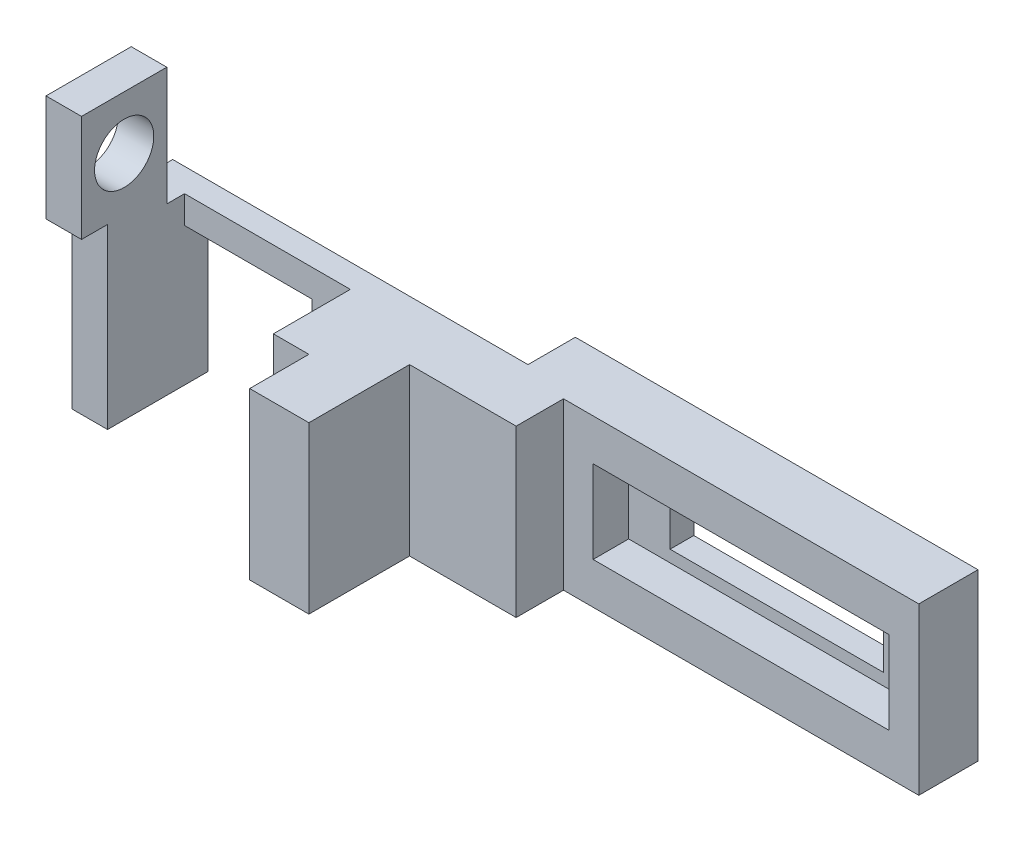
ISO-10303-21;
HEADER;
FILE_DESCRIPTION(('STEP AP214'),'2;1');
FILE_NAME('part.step','',(''),(''),'','','');
FILE_SCHEMA(('AUTOMOTIVE_DESIGN { 1 0 10303 214 1 1 1 1 }'));
ENDSEC;
DATA;
#1=APPLICATION_CONTEXT('core data for automotive mechanical design processes');
#2=APPLICATION_PROTOCOL_DEFINITION('international standard','automotive_design',2000,#1);
#3=PRODUCT_CONTEXT('',#1,'mechanical');
#4=PRODUCT('Part','Part','',(#3));
#5=PRODUCT_RELATED_PRODUCT_CATEGORY('part','',(#4));
#6=PRODUCT_DEFINITION_FORMATION('','',#4);
#7=PRODUCT_DEFINITION_CONTEXT('part definition',#1,'design');
#8=PRODUCT_DEFINITION('design','',#6,#7);
#9=PRODUCT_DEFINITION_SHAPE('','',#8);
#10=(LENGTH_UNIT() NAMED_UNIT(*) SI_UNIT(.MILLI.,.METRE.));
#11=(NAMED_UNIT(*) PLANE_ANGLE_UNIT() SI_UNIT($,.RADIAN.));
#12=(NAMED_UNIT(*) SI_UNIT($,.STERADIAN.) SOLID_ANGLE_UNIT());
#13=UNCERTAINTY_MEASURE_WITH_UNIT(LENGTH_MEASURE(1.E-05),#10,'distance_accuracy_value','');
#14=(GEOMETRIC_REPRESENTATION_CONTEXT(3) GLOBAL_UNCERTAINTY_ASSIGNED_CONTEXT((#13)) GLOBAL_UNIT_ASSIGNED_CONTEXT((#10,
#11,#12)) REPRESENTATION_CONTEXT('',''));
#15=CARTESIAN_POINT('',(0.,0.,0.));
#16=DIRECTION('',(0.,0.,1.));
#17=DIRECTION('',(1.,0.,0.));
#18=AXIS2_PLACEMENT_3D('',#15,#16,#17);
#19=CARTESIAN_POINT('',(0.,0.,0.));
#20=DIRECTION('',(0.,1.,0.));
#21=DIRECTION('',(0.,0.,1.));
#22=AXIS2_PLACEMENT_3D('',#19,#20,#21);
#23=PLANE('',#22);
#24=DIRECTION('',(1.,0.,0.));
#25=VECTOR('',#24,1.);
#26=CARTESIAN_POINT('',(3.,0.,-11.5));
#27=LINE('',#26,#25);
#28=CARTESIAN_POINT('',(13.7626568188366,0.,-11.5));
#29=VERTEX_POINT('',#28);
#30=CARTESIAN_POINT('',(17.,0.,-11.5));
#31=VERTEX_POINT('',#30);
#32=EDGE_CURVE('E253',#29,#31,#27,.T.);
#33=ORIENTED_EDGE('',*,*,#32,.F.);
#34=DIRECTION('',(0.,0.,-1.));
#35=VECTOR('',#34,1.);
#36=CARTESIAN_POINT('',(13.7626568188366,0.,-6.5));
#37=LINE('',#36,#35);
#38=CARTESIAN_POINT('',(13.7626568188366,0.,-13.5));
#39=VERTEX_POINT('',#38);
#40=EDGE_CURVE('E237',#29,#39,#37,.T.);
#41=ORIENTED_EDGE('',*,*,#40,.T.);
#42=DIRECTION('',(-1.,0.,0.));
#43=VECTOR('',#42,1.);
#44=CARTESIAN_POINT('',(0.,0.,-13.5));
#45=LINE('',#44,#43);
#46=CARTESIAN_POINT('',(30.,0.,-13.5));
#47=VERTEX_POINT('',#46);
#48=EDGE_CURVE('E251',#47,#39,#45,.T.);
#49=ORIENTED_EDGE('',*,*,#48,.F.);
#50=DIRECTION('',(0.,0.,1.));
#51=VECTOR('',#50,1.);
#52=CARTESIAN_POINT('',(30.,0.,-13.5));
#53=LINE('',#52,#51);
#54=CARTESIAN_POINT('',(30.,0.,-17.5));
#55=VERTEX_POINT('',#54);
#56=EDGE_CURVE('E266',#55,#47,#53,.T.);
#57=ORIENTED_EDGE('',*,*,#56,.F.);
#58=DIRECTION('',(-1.,0.,0.));
#59=VECTOR('',#58,1.);
#60=CARTESIAN_POINT('',(30.,0.,-17.5));
#61=LINE('',#60,#59);
#62=CARTESIAN_POINT('',(64.,0.,-17.5));
#63=VERTEX_POINT('',#62);
#64=EDGE_CURVE('E473',#63,#55,#61,.T.);
#65=ORIENTED_EDGE('',*,*,#64,.F.);
#66=DIRECTION('',(0.,0.,-1.));
#67=VECTOR('',#66,1.);
#68=CARTESIAN_POINT('',(64.,0.,-17.5));
#69=LINE('',#68,#67);
#70=CARTESIAN_POINT('',(64.,0.,-12.5));
#71=VERTEX_POINT('',#70);
#72=EDGE_CURVE('E472',#71,#63,#69,.T.);
#73=ORIENTED_EDGE('',*,*,#72,.F.);
#74=DIRECTION('',(1.,0.,0.));
#75=VECTOR('',#74,1.);
#76=CARTESIAN_POINT('',(34.,0.,-12.5));
#77=LINE('',#76,#75);
#78=CARTESIAN_POINT('',(34.,0.,-12.5));
#79=VERTEX_POINT('',#78);
#80=EDGE_CURVE('E470',#79,#71,#77,.T.);
#81=ORIENTED_EDGE('',*,*,#80,.F.);
#82=DIRECTION('',(0.,0.,-1.));
#83=VECTOR('',#82,1.);
#84=CARTESIAN_POINT('',(34.,0.,-8.5));
#85=LINE('',#84,#83);
#86=CARTESIAN_POINT('',(34.,0.,-8.5));
#87=VERTEX_POINT('',#86);
#88=EDGE_CURVE('E468',#87,#79,#85,.T.);
#89=ORIENTED_EDGE('',*,*,#88,.F.);
#90=DIRECTION('',(1.,0.,0.));
#91=VECTOR('',#90,1.);
#92=CARTESIAN_POINT('',(25.,0.,-8.5));
#93=LINE('',#92,#91);
#94=CARTESIAN_POINT('',(25.,0.,-8.5));
#95=VERTEX_POINT('',#94);
#96=EDGE_CURVE('E466',#95,#87,#93,.T.);
#97=ORIENTED_EDGE('',*,*,#96,.F.);
#98=DIRECTION('',(0.,0.,-1.));
#99=VECTOR('',#98,1.);
#100=CARTESIAN_POINT('',(25.,0.,0.));
#101=LINE('',#100,#99);
#102=CARTESIAN_POINT('',(25.,0.,0.));
#103=VERTEX_POINT('',#102);
#104=EDGE_CURVE('E464',#103,#95,#101,.T.);
#105=ORIENTED_EDGE('',*,*,#104,.F.);
#106=DIRECTION('',(1.,0.,0.));
#107=VECTOR('',#106,1.);
#108=CARTESIAN_POINT('',(20.,0.,0.));
#109=LINE('',#108,#107);
#110=CARTESIAN_POINT('',(20.,0.,0.));
#111=VERTEX_POINT('',#110);
#112=EDGE_CURVE('E431',#111,#103,#109,.T.);
#113=ORIENTED_EDGE('',*,*,#112,.F.);
#114=DIRECTION('',(0.,0.,1.));
#115=VECTOR('',#114,1.);
#116=CARTESIAN_POINT('',(20.,0.,0.));
#117=LINE('',#116,#115);
#118=CARTESIAN_POINT('',(20.,0.,-5.));
#119=VERTEX_POINT('',#118);
#120=EDGE_CURVE('E273',#119,#111,#117,.T.);
#121=ORIENTED_EDGE('',*,*,#120,.F.);
#122=DIRECTION('',(1.,0.,0.));
#123=VECTOR('',#122,1.);
#124=CARTESIAN_POINT('',(20.,0.,-5.));
#125=LINE('',#124,#123);
#126=CARTESIAN_POINT('',(17.,0.,-5.));
#127=VERTEX_POINT('',#126);
#128=EDGE_CURVE('E264',#127,#119,#125,.T.);
#129=ORIENTED_EDGE('',*,*,#128,.F.);
#130=DIRECTION('',(0.,0.,1.));
#131=VECTOR('',#130,1.);
#132=CARTESIAN_POINT('',(17.,0.,-11.5));
#133=LINE('',#132,#131);
#134=EDGE_CURVE('E525',#31,#127,#133,.T.);
#135=ORIENTED_EDGE('',*,*,#134,.F.);
#136=EDGE_LOOP('',(#33,#41,#49,#57,#65,#73,#81,#89,#97,#105,#113,#121,#129,#135));
#137=FACE_BOUND('',#136,.T.);
#138=ADVANCED_FACE('F33',(#137),#23,.F.);
#139=CARTESIAN_POINT('',(20.,14.,-5.));
#140=DIRECTION('',(0.,0.,-1.));
#141=DIRECTION('',(-1.,0.,0.));
#142=AXIS2_PLACEMENT_3D('',#139,#140,#141);
#143=PLANE('',#142);
#144=DIRECTION('',(0.,1.,0.));
#145=VECTOR('',#144,1.);
#146=CARTESIAN_POINT('',(17.,0.,-5.));
#147=LINE('',#146,#145);
#148=CARTESIAN_POINT('',(17.,14.,-5.));
#149=VERTEX_POINT('',#148);
#150=EDGE_CURVE('E330',#127,#149,#147,.T.);
#151=ORIENTED_EDGE('',*,*,#150,.F.);
#152=ORIENTED_EDGE('',*,*,#128,.T.);
#153=DIRECTION('',(0.,-1.,0.));
#154=VECTOR('',#153,1.);
#155=CARTESIAN_POINT('',(20.,14.,-5.));
#156=LINE('',#155,#154);
#157=CARTESIAN_POINT('',(20.,14.,-5.));
#158=VERTEX_POINT('',#157);
#159=EDGE_CURVE('E279',#158,#119,#156,.T.);
#160=ORIENTED_EDGE('',*,*,#159,.F.);
#161=DIRECTION('',(1.,0.,0.));
#162=VECTOR('',#161,1.);
#163=CARTESIAN_POINT('',(20.,14.,-5.));
#164=LINE('',#163,#162);
#165=EDGE_CURVE('E459',#149,#158,#164,.T.);
#166=ORIENTED_EDGE('',*,*,#165,.F.);
#167=EDGE_LOOP('',(#151,#152,#160,#166));
#168=FACE_BOUND('',#167,.T.);
#169=ADVANCED_FACE('F521',(#168),#143,.F.);
#170=CARTESIAN_POINT('',(20.,14.,0.));
#171=DIRECTION('',(0.,0.,-1.));
#172=DIRECTION('',(-1.,0.,0.));
#173=AXIS2_PLACEMENT_3D('',#170,#171,#172);
#174=PLANE('',#173);
#175=ORIENTED_EDGE('',*,*,#112,.T.);
#176=DIRECTION('',(0.,-1.,0.));
#177=VECTOR('',#176,1.);
#178=CARTESIAN_POINT('',(25.,14.,0.));
#179=LINE('',#178,#177);
#180=CARTESIAN_POINT('',(25.,14.,0.));
#181=VERTEX_POINT('',#180);
#182=EDGE_CURVE('E308',#181,#103,#179,.T.);
#183=ORIENTED_EDGE('',*,*,#182,.F.);
#184=DIRECTION('',(1.,0.,0.));
#185=VECTOR('',#184,1.);
#186=CARTESIAN_POINT('',(20.,14.,0.));
#187=LINE('',#186,#185);
#188=CARTESIAN_POINT('',(20.,14.,0.));
#189=VERTEX_POINT('',#188);
#190=EDGE_CURVE('E275',#189,#181,#187,.T.);
#191=ORIENTED_EDGE('',*,*,#190,.F.);
#192=DIRECTION('',(0.,-1.,0.));
#193=VECTOR('',#192,1.);
#194=CARTESIAN_POINT('',(20.,14.,0.));
#195=LINE('',#194,#193);
#196=EDGE_CURVE('E276',#189,#111,#195,.T.);
#197=ORIENTED_EDGE('',*,*,#196,.T.);
#198=EDGE_LOOP('',(#175,#183,#191,#197));
#199=FACE_BOUND('',#198,.T.);
#200=ADVANCED_FACE('F35',(#199),#174,.F.);
#201=CARTESIAN_POINT('',(25.,14.,0.));
#202=DIRECTION('',(-1.,0.,0.));
#203=DIRECTION('',(0.,0.,1.));
#204=AXIS2_PLACEMENT_3D('',#201,#202,#203);
#205=PLANE('',#204);
#206=ORIENTED_EDGE('',*,*,#104,.T.);
#207=DIRECTION('',(0.,-1.,0.));
#208=VECTOR('',#207,1.);
#209=CARTESIAN_POINT('',(25.,14.,-8.5));
#210=LINE('',#209,#208);
#211=CARTESIAN_POINT('',(25.,14.,-8.5));
#212=VERTEX_POINT('',#211);
#213=EDGE_CURVE('E305',#212,#95,#210,.T.);
#214=ORIENTED_EDGE('',*,*,#213,.F.);
#215=DIRECTION('',(0.,0.,-1.));
#216=VECTOR('',#215,1.);
#217=CARTESIAN_POINT('',(25.,14.,0.));
#218=LINE('',#217,#216);
#219=EDGE_CURVE('E440',#181,#212,#218,.T.);
#220=ORIENTED_EDGE('',*,*,#219,.F.);
#221=ORIENTED_EDGE('',*,*,#182,.T.);
#222=EDGE_LOOP('',(#206,#214,#220,#221));
#223=FACE_BOUND('',#222,.T.);
#224=ADVANCED_FACE('F507',(#223),#205,.F.);
#225=CARTESIAN_POINT('',(25.,14.,-8.5));
#226=DIRECTION('',(0.,0.,-1.));
#227=DIRECTION('',(-1.,0.,0.));
#228=AXIS2_PLACEMENT_3D('',#225,#226,#227);
#229=PLANE('',#228);
#230=ORIENTED_EDGE('',*,*,#96,.T.);
#231=DIRECTION('',(0.,-1.,0.));
#232=VECTOR('',#231,1.);
#233=CARTESIAN_POINT('',(34.,14.,-8.5));
#234=LINE('',#233,#232);
#235=CARTESIAN_POINT('',(34.,14.,-8.5));
#236=VERTEX_POINT('',#235);
#237=EDGE_CURVE('E302',#236,#87,#234,.T.);
#238=ORIENTED_EDGE('',*,*,#237,.F.);
#239=DIRECTION('',(1.,0.,0.));
#240=VECTOR('',#239,1.);
#241=CARTESIAN_POINT('',(25.,14.,-8.5));
#242=LINE('',#241,#240);
#243=EDGE_CURVE('E442',#212,#236,#242,.T.);
#244=ORIENTED_EDGE('',*,*,#243,.F.);
#245=ORIENTED_EDGE('',*,*,#213,.T.);
#246=EDGE_LOOP('',(#230,#238,#244,#245));
#247=FACE_BOUND('',#246,.T.);
#248=ADVANCED_FACE('F503',(#247),#229,.F.);
#249=CARTESIAN_POINT('',(34.,14.,-8.5));
#250=DIRECTION('',(-1.,0.,0.));
#251=DIRECTION('',(0.,0.,1.));
#252=AXIS2_PLACEMENT_3D('',#249,#250,#251);
#253=PLANE('',#252);
#254=ORIENTED_EDGE('',*,*,#88,.T.);
#255=DIRECTION('',(0.,-1.,0.));
#256=VECTOR('',#255,1.);
#257=CARTESIAN_POINT('',(34.,14.,-12.5));
#258=LINE('',#257,#256);
#259=CARTESIAN_POINT('',(34.,14.,-12.5));
#260=VERTEX_POINT('',#259);
#261=EDGE_CURVE('E299',#260,#79,#258,.T.);
#262=ORIENTED_EDGE('',*,*,#261,.F.);
#263=DIRECTION('',(0.,0.,-1.));
#264=VECTOR('',#263,1.);
#265=CARTESIAN_POINT('',(34.,14.,-8.5));
#266=LINE('',#265,#264);
#267=EDGE_CURVE('E444',#236,#260,#266,.T.);
#268=ORIENTED_EDGE('',*,*,#267,.F.);
#269=ORIENTED_EDGE('',*,*,#237,.T.);
#270=EDGE_LOOP('',(#254,#262,#268,#269));
#271=FACE_BOUND('',#270,.T.);
#272=ADVANCED_FACE('F498',(#271),#253,.F.);
#273=CARTESIAN_POINT('',(34.,14.,-12.5));
#274=DIRECTION('',(0.,0.,-1.));
#275=DIRECTION('',(-1.,0.,0.));
#276=AXIS2_PLACEMENT_3D('',#273,#274,#275);
#277=PLANE('',#276);
#278=DIRECTION('',(-1.,0.,0.));
#279=VECTOR('',#278,1.);
#280=CARTESIAN_POINT('',(61.5,10.5,-12.5));
#281=LINE('',#280,#279);
#282=CARTESIAN_POINT('',(61.5,10.5,-12.5));
#283=VERTEX_POINT('',#282);
#284=CARTESIAN_POINT('',(36.5,10.5,-12.5));
#285=VERTEX_POINT('',#284);
#286=EDGE_CURVE('E421',#283,#285,#281,.T.);
#287=ORIENTED_EDGE('',*,*,#286,.F.);
#288=DIRECTION('',(0.,1.,0.));
#289=VECTOR('',#288,1.);
#290=CARTESIAN_POINT('',(61.5,3.49999999999999,-12.5));
#291=LINE('',#290,#289);
#292=CARTESIAN_POINT('',(61.5,3.49999999999999,-12.5));
#293=VERTEX_POINT('',#292);
#294=EDGE_CURVE('E400',#293,#283,#291,.T.);
#295=ORIENTED_EDGE('',*,*,#294,.F.);
#296=DIRECTION('',(1.,0.,0.));
#297=VECTOR('',#296,1.);
#298=CARTESIAN_POINT('',(61.5,3.49999999999999,-12.5));
#299=LINE('',#298,#297);
#300=CARTESIAN_POINT('',(36.5,3.49999999999999,-12.5));
#301=VERTEX_POINT('',#300);
#302=EDGE_CURVE('E410',#301,#293,#299,.T.);
#303=ORIENTED_EDGE('',*,*,#302,.F.);
#304=DIRECTION('',(0.,-1.,0.));
#305=VECTOR('',#304,1.);
#306=CARTESIAN_POINT('',(36.5,3.49999999999999,-12.5));
#307=LINE('',#306,#305);
#308=EDGE_CURVE('E424',#285,#301,#307,.T.);
#309=ORIENTED_EDGE('',*,*,#308,.F.);
#310=EDGE_LOOP('',(#287,#295,#303,#309));
#311=FACE_BOUND('',#310,.T.);
#312=ORIENTED_EDGE('',*,*,#80,.T.);
#313=DIRECTION('',(0.,-1.,0.));
#314=VECTOR('',#313,1.);
#315=CARTESIAN_POINT('',(64.,14.,-12.5));
#316=LINE('',#315,#314);
#317=CARTESIAN_POINT('',(64.,14.,-12.5));
#318=VERTEX_POINT('',#317);
#319=EDGE_CURVE('E296',#318,#71,#316,.T.);
#320=ORIENTED_EDGE('',*,*,#319,.F.);
#321=DIRECTION('',(1.,0.,0.));
#322=VECTOR('',#321,1.);
#323=CARTESIAN_POINT('',(34.,14.,-12.5));
#324=LINE('',#323,#322);
#325=EDGE_CURVE('E446',#260,#318,#324,.T.);
#326=ORIENTED_EDGE('',*,*,#325,.F.);
#327=ORIENTED_EDGE('',*,*,#261,.T.);
#328=EDGE_LOOP('',(#312,#320,#326,#327));
#329=FACE_BOUND('',#328,.T.);
#330=ADVANCED_FACE('F496',(#311,#329),#277,.F.);
#331=CARTESIAN_POINT('',(64.,14.,-17.5));
#332=DIRECTION('',(-1.,0.,0.));
#333=DIRECTION('',(0.,0.,1.));
#334=AXIS2_PLACEMENT_3D('',#331,#332,#333);
#335=PLANE('',#334);
#336=ORIENTED_EDGE('',*,*,#72,.T.);
#337=DIRECTION('',(0.,-1.,0.));
#338=VECTOR('',#337,1.);
#339=CARTESIAN_POINT('',(64.,14.,-17.5));
#340=LINE('',#339,#338);
#341=CARTESIAN_POINT('',(64.,14.,-17.5));
#342=VERTEX_POINT('',#341);
#343=EDGE_CURVE('E293',#342,#63,#340,.T.);
#344=ORIENTED_EDGE('',*,*,#343,.F.);
#345=DIRECTION('',(0.,0.,-1.));
#346=VECTOR('',#345,1.);
#347=CARTESIAN_POINT('',(64.,14.,-17.5));
#348=LINE('',#347,#346);
#349=EDGE_CURVE('E448',#318,#342,#348,.T.);
#350=ORIENTED_EDGE('',*,*,#349,.F.);
#351=ORIENTED_EDGE('',*,*,#319,.T.);
#352=EDGE_LOOP('',(#336,#344,#350,#351));
#353=FACE_BOUND('',#352,.T.);
#354=ADVANCED_FACE('F485',(#353),#335,.F.);
#355=CARTESIAN_POINT('',(30.,14.,-17.5));
#356=DIRECTION('',(0.,0.,1.));
#357=DIRECTION('',(1.,0.,0.));
#358=AXIS2_PLACEMENT_3D('',#355,#356,#357);
#359=PLANE('',#358);
#360=DIRECTION('',(-1.,0.,0.));
#361=VECTOR('',#360,1.);
#362=CARTESIAN_POINT('',(58.,9.49999999999999,-17.5));
#363=LINE('',#362,#361);
#364=CARTESIAN_POINT('',(58.,9.49999999999999,-17.5));
#365=VERTEX_POINT('',#364);
#366=CARTESIAN_POINT('',(40.,9.5,-17.5));
#367=VERTEX_POINT('',#366);
#368=EDGE_CURVE('E386',#365,#367,#363,.T.);
#369=ORIENTED_EDGE('',*,*,#368,.T.);
#370=DIRECTION('',(0.,-1.,0.));
#371=VECTOR('',#370,1.);
#372=CARTESIAN_POINT('',(40.,9.5,-17.5));
#373=LINE('',#372,#371);
#374=CARTESIAN_POINT('',(40.,4.49999999999999,-17.5));
#375=VERTEX_POINT('',#374);
#376=EDGE_CURVE('E376',#367,#375,#373,.T.);
#377=ORIENTED_EDGE('',*,*,#376,.T.);
#378=DIRECTION('',(1.,0.,0.));
#379=VECTOR('',#378,1.);
#380=CARTESIAN_POINT('',(58.,4.49999999999999,-17.5));
#381=LINE('',#380,#379);
#382=CARTESIAN_POINT('',(58.,4.49999999999999,-17.5));
#383=VERTEX_POINT('',#382);
#384=EDGE_CURVE('E379',#375,#383,#381,.T.);
#385=ORIENTED_EDGE('',*,*,#384,.T.);
#386=DIRECTION('',(0.,1.,0.));
#387=VECTOR('',#386,1.);
#388=CARTESIAN_POINT('',(58.,9.49999999999999,-17.5));
#389=LINE('',#388,#387);
#390=EDGE_CURVE('E383',#383,#365,#389,.T.);
#391=ORIENTED_EDGE('',*,*,#390,.T.);
#392=EDGE_LOOP('',(#369,#377,#385,#391));
#393=FACE_BOUND('',#392,.T.);
#394=ORIENTED_EDGE('',*,*,#64,.T.);
#395=DIRECTION('',(0.,-1.,0.));
#396=VECTOR('',#395,1.);
#397=CARTESIAN_POINT('',(30.,14.,-17.5));
#398=LINE('',#397,#396);
#399=CARTESIAN_POINT('',(30.,14.,-17.5));
#400=VERTEX_POINT('',#399);
#401=EDGE_CURVE('E290',#400,#55,#398,.T.);
#402=ORIENTED_EDGE('',*,*,#401,.F.);
#403=DIRECTION('',(-1.,0.,0.));
#404=VECTOR('',#403,1.);
#405=CARTESIAN_POINT('',(30.,14.,-17.5));
#406=LINE('',#405,#404);
#407=EDGE_CURVE('E450',#342,#400,#406,.T.);
#408=ORIENTED_EDGE('',*,*,#407,.F.);
#409=ORIENTED_EDGE('',*,*,#343,.T.);
#410=EDGE_LOOP('',(#394,#402,#408,#409));
#411=FACE_BOUND('',#410,.T.);
#412=ADVANCED_FACE('F489',(#393,#411),#359,.F.);
#413=CARTESIAN_POINT('',(30.,14.,-13.5));
#414=DIRECTION('',(1.,0.,0.));
#415=DIRECTION('',(0.,0.,-1.));
#416=AXIS2_PLACEMENT_3D('',#413,#414,#415);
#417=PLANE('',#416);
#418=ORIENTED_EDGE('',*,*,#56,.T.);
#419=DIRECTION('',(0.,-1.,0.));
#420=VECTOR('',#419,1.);
#421=CARTESIAN_POINT('',(30.,14.,-13.5));
#422=LINE('',#421,#420);
#423=CARTESIAN_POINT('',(30.,14.,-13.5));
#424=VERTEX_POINT('',#423);
#425=EDGE_CURVE('E260',#424,#47,#422,.T.);
#426=ORIENTED_EDGE('',*,*,#425,.F.);
#427=DIRECTION('',(0.,0.,1.));
#428=VECTOR('',#427,1.);
#429=CARTESIAN_POINT('',(30.,14.,-13.5));
#430=LINE('',#429,#428);
#431=EDGE_CURVE('E452',#400,#424,#430,.T.);
#432=ORIENTED_EDGE('',*,*,#431,.F.);
#433=ORIENTED_EDGE('',*,*,#401,.T.);
#434=EDGE_LOOP('',(#418,#426,#432,#433));
#435=FACE_BOUND('',#434,.T.);
#436=ADVANCED_FACE('F478',(#435),#417,.F.);
#437=CARTESIAN_POINT('',(0.,14.,-13.5));
#438=DIRECTION('',(0.,0.,1.));
#439=DIRECTION('',(1.,0.,0.));
#440=AXIS2_PLACEMENT_3D('',#437,#438,#439);
#441=PLANE('',#440);
#442=ORIENTED_EDGE('',*,*,#48,.T.);
#443=DIRECTION('',(0.,-1.,0.));
#444=VECTOR('',#443,1.);
#445=CARTESIAN_POINT('',(13.7626568188366,0.,-13.5));
#446=LINE('',#445,#444);
#447=CARTESIAN_POINT('',(13.7626568188366,11.6719902305546,-13.5));
#448=VERTEX_POINT('',#447);
#449=EDGE_CURVE('E234',#448,#39,#446,.T.);
#450=ORIENTED_EDGE('',*,*,#449,.F.);
#451=DIRECTION('',(1.,0.,0.));
#452=VECTOR('',#451,1.);
#453=CARTESIAN_POINT('',(13.7626568188366,11.6719902305546,-13.5));
#454=LINE('',#453,#452);
#455=CARTESIAN_POINT('',(3.,11.6719902305546,-13.5));
#456=VERTEX_POINT('',#455);
#457=EDGE_CURVE('E254',#456,#448,#454,.T.);
#458=ORIENTED_EDGE('',*,*,#457,.F.);
#459=DIRECTION('',(0.,1.,0.));
#460=VECTOR('',#459,1.);
#461=CARTESIAN_POINT('',(3.,0.,-13.5));
#462=LINE('',#461,#460);
#463=CARTESIAN_POINT('',(3.,0.,-13.5));
#464=VERTEX_POINT('',#463);
#465=EDGE_CURVE('E245',#464,#456,#462,.T.);
#466=ORIENTED_EDGE('',*,*,#465,.F.);
#467=CARTESIAN_POINT('',(0.,0.,-13.5));
#468=VERTEX_POINT('',#467);
#469=EDGE_CURVE('E262',#464,#468,#45,.T.);
#470=ORIENTED_EDGE('',*,*,#469,.T.);
#471=DIRECTION('',(0.,-1.,0.));
#472=VECTOR('',#471,1.);
#473=CARTESIAN_POINT('',(0.,14.,-13.5));
#474=LINE('',#473,#472);
#475=CARTESIAN_POINT('',(0.,14.,-13.5));
#476=VERTEX_POINT('',#475);
#477=EDGE_CURVE('E286',#476,#468,#474,.T.);
#478=ORIENTED_EDGE('',*,*,#477,.F.);
#479=DIRECTION('',(-1.,0.,0.));
#480=VECTOR('',#479,1.);
#481=CARTESIAN_POINT('',(0.,14.,-13.5));
#482=LINE('',#481,#480);
#483=EDGE_CURVE('E454',#424,#476,#482,.T.);
#484=ORIENTED_EDGE('',*,*,#483,.F.);
#485=ORIENTED_EDGE('',*,*,#425,.T.);
#486=EDGE_LOOP('',(#442,#450,#458,#466,#470,#478,#484,#485));
#487=FACE_BOUND('',#486,.T.);
#488=ADVANCED_FACE('F257',(#487),#441,.F.);
#489=CARTESIAN_POINT('',(0.,14.,-5.));
#490=DIRECTION('',(1.,0.,0.));
#491=DIRECTION('',(0.,0.,-1.));
#492=AXIS2_PLACEMENT_3D('',#489,#490,#491);
#493=PLANE('',#492);
#494=CARTESIAN_POINT('',(0.,19.5,-6.40044412179853));
#495=DIRECTION('',(-1.,0.,0.));
#496=DIRECTION('',(0.,0.,1.));
#497=AXIS2_PLACEMENT_3D('',#494,#495,#496);
#498=CIRCLE('',#497,2.5);
#499=CARTESIAN_POINT('',(0.,19.5,-3.90044412179853));
#500=VERTEX_POINT('',#499);
#501=EDGE_CURVE('E314',#500,#500,#498,.T.);
#502=ORIENTED_EDGE('',*,*,#501,.F.);
#503=EDGE_LOOP('',(#502));
#504=FACE_BOUND('',#503,.T.);
#505=DIRECTION('',(0.,0.,1.));
#506=VECTOR('',#505,1.);
#507=CARTESIAN_POINT('',(0.,0.,-5.));
#508=LINE('',#507,#506);
#509=CARTESIAN_POINT('',(0.,0.,-5.));
#510=VERTEX_POINT('',#509);
#511=EDGE_CURVE('E261',#468,#510,#508,.T.);
#512=ORIENTED_EDGE('',*,*,#511,.T.);
#513=DIRECTION('',(0.,-1.,0.));
#514=VECTOR('',#513,1.);
#515=CARTESIAN_POINT('',(0.,14.,-5.));
#516=LINE('',#515,#514);
#517=CARTESIAN_POINT('',(0.,15.,-5.));
#518=VERTEX_POINT('',#517);
#519=EDGE_CURVE('E283',#518,#510,#516,.T.);
#520=ORIENTED_EDGE('',*,*,#519,.F.);
#521=DIRECTION('',(0.,0.,1.));
#522=VECTOR('',#521,1.);
#523=CARTESIAN_POINT('',(0.,15.,-2.80088824359706));
#524=LINE('',#523,#522);
#525=CARTESIAN_POINT('',(0.,15.,-2.80088824359706));
#526=VERTEX_POINT('',#525);
#527=EDGE_CURVE('E313',#518,#526,#524,.T.);
#528=ORIENTED_EDGE('',*,*,#527,.T.);
#529=DIRECTION('',(0.,1.,0.));
#530=VECTOR('',#529,1.);
#531=CARTESIAN_POINT('',(0.,24.,-2.80088824359706));
#532=LINE('',#531,#530);
#533=CARTESIAN_POINT('',(0.,24.,-2.80088824359706));
#534=VERTEX_POINT('',#533);
#535=EDGE_CURVE('E357',#526,#534,#532,.T.);
#536=ORIENTED_EDGE('',*,*,#535,.T.);
#537=DIRECTION('',(0.,0.,-1.));
#538=VECTOR('',#537,1.);
#539=CARTESIAN_POINT('',(0.,24.,-10.));
#540=LINE('',#539,#538);
#541=CARTESIAN_POINT('',(0.,24.,-10.));
#542=VERTEX_POINT('',#541);
#543=EDGE_CURVE('E360',#534,#542,#540,.T.);
#544=ORIENTED_EDGE('',*,*,#543,.T.);
#545=DIRECTION('',(0.,-1.,0.));
#546=VECTOR('',#545,1.);
#547=CARTESIAN_POINT('',(0.,14.,-10.));
#548=LINE('',#547,#546);
#549=CARTESIAN_POINT('',(0.,14.,-10.));
#550=VERTEX_POINT('',#549);
#551=EDGE_CURVE('E342',#542,#550,#548,.T.);
#552=ORIENTED_EDGE('',*,*,#551,.T.);
#553=DIRECTION('',(0.,0.,1.));
#554=VECTOR('',#553,1.);
#555=CARTESIAN_POINT('',(0.,14.,-5.));
#556=LINE('',#555,#554);
#557=EDGE_CURVE('E456',#476,#550,#556,.T.);
#558=ORIENTED_EDGE('',*,*,#557,.F.);
#559=ORIENTED_EDGE('',*,*,#477,.T.);
#560=EDGE_LOOP('',(#512,#520,#528,#536,#544,#552,#558,#559));
#561=FACE_BOUND('',#560,.T.);
#562=ADVANCED_FACE('F547',(#504,#561),#493,.F.);
#563=CARTESIAN_POINT('',(3.,0.,-5.));
#564=VERTEX_POINT('',#563);
#565=EDGE_CURVE('E270',#510,#564,#125,.T.);
#566=ORIENTED_EDGE('',*,*,#565,.T.);
#567=DIRECTION('',(0.,1.,0.));
#568=VECTOR('',#567,1.);
#569=CARTESIAN_POINT('',(3.,14.,-5.));
#570=LINE('',#569,#568);
#571=CARTESIAN_POINT('',(3.,15.,-5.));
#572=VERTEX_POINT('',#571);
#573=EDGE_CURVE('E338',#564,#572,#570,.T.);
#574=ORIENTED_EDGE('',*,*,#573,.T.);
#575=DIRECTION('',(-1.,0.,0.));
#576=VECTOR('',#575,1.);
#577=CARTESIAN_POINT('',(3.,15.,-5.));
#578=LINE('',#577,#576);
#579=EDGE_CURVE('E354',#572,#518,#578,.T.);
#580=ORIENTED_EDGE('',*,*,#579,.T.);
#581=ORIENTED_EDGE('',*,*,#519,.T.);
#582=EDGE_LOOP('',(#566,#574,#580,#581));
#583=FACE_BOUND('',#582,.T.);
#584=ADVANCED_FACE('F550',(#583),#143,.F.);
#585=CARTESIAN_POINT('',(20.,14.,0.));
#586=DIRECTION('',(1.,0.,0.));
#587=DIRECTION('',(0.,0.,-1.));
#588=AXIS2_PLACEMENT_3D('',#585,#586,#587);
#589=PLANE('',#588);
#590=ORIENTED_EDGE('',*,*,#120,.T.);
#591=ORIENTED_EDGE('',*,*,#196,.F.);
#592=DIRECTION('',(0.,0.,1.));
#593=VECTOR('',#592,1.);
#594=CARTESIAN_POINT('',(20.,14.,0.));
#595=LINE('',#594,#593);
#596=EDGE_CURVE('E280',#158,#189,#595,.T.);
#597=ORIENTED_EDGE('',*,*,#596,.F.);
#598=ORIENTED_EDGE('',*,*,#159,.T.);
#599=EDGE_LOOP('',(#590,#591,#597,#598));
#600=FACE_BOUND('',#599,.T.);
#601=ADVANCED_FACE('F515',(#600),#589,.F.);
#602=CARTESIAN_POINT('',(0.,14.,0.));
#603=DIRECTION('',(0.,1.,0.));
#604=DIRECTION('',(0.,0.,1.));
#605=AXIS2_PLACEMENT_3D('',#602,#603,#604);
#606=PLANE('',#605);
#607=DIRECTION('',(0.,0.,-1.));
#608=VECTOR('',#607,1.);
#609=CARTESIAN_POINT('',(3.,14.,-5.));
#610=LINE('',#609,#608);
#611=CARTESIAN_POINT('',(3.,14.,-10.));
#612=VERTEX_POINT('',#611);
#613=CARTESIAN_POINT('',(3.,14.,-11.5));
#614=VERTEX_POINT('',#613);
#615=EDGE_CURVE('E327',#612,#614,#610,.T.);
#616=ORIENTED_EDGE('',*,*,#615,.T.);
#617=DIRECTION('',(1.,0.,0.));
#618=VECTOR('',#617,1.);
#619=CARTESIAN_POINT('',(3.,14.,-11.5));
#620=LINE('',#619,#618);
#621=CARTESIAN_POINT('',(17.,14.,-11.5));
#622=VERTEX_POINT('',#621);
#623=EDGE_CURVE('E324',#614,#622,#620,.T.);
#624=ORIENTED_EDGE('',*,*,#623,.T.);
#625=DIRECTION('',(0.,0.,-1.));
#626=VECTOR('',#625,1.);
#627=CARTESIAN_POINT('',(17.,14.,-5.));
#628=LINE('',#627,#626);
#629=EDGE_CURVE('E531',#149,#622,#628,.T.);
#630=ORIENTED_EDGE('',*,*,#629,.F.);
#631=ORIENTED_EDGE('',*,*,#165,.T.);
#632=ORIENTED_EDGE('',*,*,#596,.T.);
#633=ORIENTED_EDGE('',*,*,#190,.T.);
#634=ORIENTED_EDGE('',*,*,#219,.T.);
#635=ORIENTED_EDGE('',*,*,#243,.T.);
#636=ORIENTED_EDGE('',*,*,#267,.T.);
#637=ORIENTED_EDGE('',*,*,#325,.T.);
#638=ORIENTED_EDGE('',*,*,#349,.T.);
#639=ORIENTED_EDGE('',*,*,#407,.T.);
#640=ORIENTED_EDGE('',*,*,#431,.T.);
#641=ORIENTED_EDGE('',*,*,#483,.T.);
#642=ORIENTED_EDGE('',*,*,#557,.T.);
#643=DIRECTION('',(-1.,0.,0.));
#644=VECTOR('',#643,1.);
#645=CARTESIAN_POINT('',(3.,14.,-10.));
#646=LINE('',#645,#644);
#647=EDGE_CURVE('E365',#612,#550,#646,.T.);
#648=ORIENTED_EDGE('',*,*,#647,.F.);
#649=EDGE_LOOP('',(#616,#624,#630,#631,#632,#633,#634,#635,#636,#637,#638,#639,#640,#641,#642,#648));
#650=FACE_BOUND('',#649,.T.);
#651=ADVANCED_FACE('F491',(#650),#606,.T.);
#652=ORIENTED_EDGE('',*,*,#469,.F.);
#653=DIRECTION('',(0.,0.,1.));
#654=VECTOR('',#653,1.);
#655=CARTESIAN_POINT('',(3.,0.,-11.5));
#656=LINE('',#655,#654);
#657=EDGE_CURVE('E326',#464,#564,#656,.T.);
#658=ORIENTED_EDGE('',*,*,#657,.T.);
#659=ORIENTED_EDGE('',*,*,#565,.F.);
#660=ORIENTED_EDGE('',*,*,#511,.F.);
#661=EDGE_LOOP('',(#652,#658,#659,#660));
#662=FACE_BOUND('',#661,.T.);
#663=ADVANCED_FACE('F544',(#662),#23,.F.);
#664=CARTESIAN_POINT('',(61.5,3.49999999999999,-15.5));
#665=DIRECTION('',(1.,0.,0.));
#666=DIRECTION('',(0.,0.,-1.));
#667=AXIS2_PLACEMENT_3D('',#664,#665,#666);
#668=PLANE('',#667);
#669=ORIENTED_EDGE('',*,*,#294,.T.);
#670=DIRECTION('',(0.,0.,1.));
#671=VECTOR('',#670,1.);
#672=CARTESIAN_POINT('',(61.5,10.5,-15.5));
#673=LINE('',#672,#671);
#674=CARTESIAN_POINT('',(61.5,10.5,-15.5));
#675=VERTEX_POINT('',#674);
#676=EDGE_CURVE('E419',#675,#283,#673,.T.);
#677=ORIENTED_EDGE('',*,*,#676,.F.);
#678=DIRECTION('',(0.,1.,0.));
#679=VECTOR('',#678,1.);
#680=CARTESIAN_POINT('',(61.5,3.49999999999999,-15.5));
#681=LINE('',#680,#679);
#682=CARTESIAN_POINT('',(61.5,3.49999999999999,-15.5));
#683=VERTEX_POINT('',#682);
#684=EDGE_CURVE('E406',#683,#675,#681,.T.);
#685=ORIENTED_EDGE('',*,*,#684,.F.);
#686=DIRECTION('',(0.,0.,1.));
#687=VECTOR('',#686,1.);
#688=CARTESIAN_POINT('',(61.5,3.49999999999999,-15.5));
#689=LINE('',#688,#687);
#690=EDGE_CURVE('E429',#683,#293,#689,.T.);
#691=ORIENTED_EDGE('',*,*,#690,.T.);
#692=EDGE_LOOP('',(#669,#677,#685,#691));
#693=FACE_BOUND('',#692,.T.);
#694=ADVANCED_FACE('F587',(#693),#668,.F.);
#695=CARTESIAN_POINT('',(61.5,3.49999999999999,-15.5));
#696=DIRECTION('',(0.,-1.,0.));
#697=DIRECTION('',(1.,0.,0.));
#698=AXIS2_PLACEMENT_3D('',#695,#696,#697);
#699=PLANE('',#698);
#700=ORIENTED_EDGE('',*,*,#302,.T.);
#701=ORIENTED_EDGE('',*,*,#690,.F.);
#702=DIRECTION('',(1.,0.,0.));
#703=VECTOR('',#702,1.);
#704=CARTESIAN_POINT('',(61.5,3.49999999999999,-15.5));
#705=LINE('',#704,#703);
#706=CARTESIAN_POINT('',(36.5,3.49999999999999,-15.5));
#707=VERTEX_POINT('',#706);
#708=EDGE_CURVE('E416',#707,#683,#705,.T.);
#709=ORIENTED_EDGE('',*,*,#708,.F.);
#710=DIRECTION('',(0.,0.,1.));
#711=VECTOR('',#710,1.);
#712=CARTESIAN_POINT('',(36.5,3.49999999999999,-15.5));
#713=LINE('',#712,#711);
#714=EDGE_CURVE('E432',#707,#301,#713,.T.);
#715=ORIENTED_EDGE('',*,*,#714,.T.);
#716=EDGE_LOOP('',(#700,#701,#709,#715));
#717=FACE_BOUND('',#716,.T.);
#718=ADVANCED_FACE('F592',(#717),#699,.F.);
#719=CARTESIAN_POINT('',(36.5,3.49999999999999,-15.5));
#720=DIRECTION('',(-1.,0.,0.));
#721=DIRECTION('',(0.,0.,1.));
#722=AXIS2_PLACEMENT_3D('',#719,#720,#721);
#723=PLANE('',#722);
#724=ORIENTED_EDGE('',*,*,#308,.T.);
#725=ORIENTED_EDGE('',*,*,#714,.F.);
#726=DIRECTION('',(0.,-1.,0.));
#727=VECTOR('',#726,1.);
#728=CARTESIAN_POINT('',(36.5,3.49999999999999,-15.5));
#729=LINE('',#728,#727);
#730=CARTESIAN_POINT('',(36.5,10.5,-15.5));
#731=VERTEX_POINT('',#730);
#732=EDGE_CURVE('E413',#731,#707,#729,.T.);
#733=ORIENTED_EDGE('',*,*,#732,.F.);
#734=DIRECTION('',(0.,0.,1.));
#735=VECTOR('',#734,1.);
#736=CARTESIAN_POINT('',(36.5,10.5,-15.5));
#737=LINE('',#736,#735);
#738=EDGE_CURVE('E434',#731,#285,#737,.T.);
#739=ORIENTED_EDGE('',*,*,#738,.T.);
#740=EDGE_LOOP('',(#724,#725,#733,#739));
#741=FACE_BOUND('',#740,.T.);
#742=ADVANCED_FACE('F603',(#741),#723,.F.);
#743=CARTESIAN_POINT('',(61.5,10.5,-15.5));
#744=DIRECTION('',(0.,1.,0.));
#745=DIRECTION('',(-1.,0.,0.));
#746=AXIS2_PLACEMENT_3D('',#743,#744,#745);
#747=PLANE('',#746);
#748=ORIENTED_EDGE('',*,*,#286,.T.);
#749=ORIENTED_EDGE('',*,*,#738,.F.);
#750=DIRECTION('',(-1.,0.,0.));
#751=VECTOR('',#750,1.);
#752=CARTESIAN_POINT('',(61.5,10.5,-15.5));
#753=LINE('',#752,#751);
#754=EDGE_CURVE('E409',#675,#731,#753,.T.);
#755=ORIENTED_EDGE('',*,*,#754,.F.);
#756=ORIENTED_EDGE('',*,*,#676,.T.);
#757=EDGE_LOOP('',(#748,#749,#755,#756));
#758=FACE_BOUND('',#757,.T.);
#759=ADVANCED_FACE('F599',(#758),#747,.F.);
#760=CARTESIAN_POINT('',(0.,0.,-15.5));
#761=DIRECTION('',(0.,0.,1.));
#762=DIRECTION('',(1.,0.,0.));
#763=AXIS2_PLACEMENT_3D('',#760,#761,#762);
#764=PLANE('',#763);
#765=DIRECTION('',(0.,-1.,0.));
#766=VECTOR('',#765,1.);
#767=CARTESIAN_POINT('',(40.,9.5,-15.5));
#768=LINE('',#767,#766);
#769=CARTESIAN_POINT('',(40.,9.5,-15.5));
#770=VERTEX_POINT('',#769);
#771=CARTESIAN_POINT('',(40.,4.49999999999999,-15.5));
#772=VERTEX_POINT('',#771);
#773=EDGE_CURVE('E367',#770,#772,#768,.T.);
#774=ORIENTED_EDGE('',*,*,#773,.F.);
#775=DIRECTION('',(-1.,0.,0.));
#776=VECTOR('',#775,1.);
#777=CARTESIAN_POINT('',(58.,9.49999999999999,-15.5));
#778=LINE('',#777,#776);
#779=CARTESIAN_POINT('',(58.,9.49999999999999,-15.5));
#780=VERTEX_POINT('',#779);
#781=EDGE_CURVE('E380',#780,#770,#778,.T.);
#782=ORIENTED_EDGE('',*,*,#781,.F.);
#783=DIRECTION('',(0.,1.,0.));
#784=VECTOR('',#783,1.);
#785=CARTESIAN_POINT('',(58.,9.49999999999999,-15.5));
#786=LINE('',#785,#784);
#787=CARTESIAN_POINT('',(58.,4.49999999999999,-15.5));
#788=VERTEX_POINT('',#787);
#789=EDGE_CURVE('E56',#788,#780,#786,.T.);
#790=ORIENTED_EDGE('',*,*,#789,.F.);
#791=DIRECTION('',(1.,0.,0.));
#792=VECTOR('',#791,1.);
#793=CARTESIAN_POINT('',(58.,4.49999999999999,-15.5));
#794=LINE('',#793,#792);
#795=EDGE_CURVE('E392',#772,#788,#794,.T.);
#796=ORIENTED_EDGE('',*,*,#795,.F.);
#797=EDGE_LOOP('',(#774,#782,#790,#796));
#798=FACE_BOUND('',#797,.T.);
#799=ORIENTED_EDGE('',*,*,#684,.T.);
#800=ORIENTED_EDGE('',*,*,#754,.T.);
#801=ORIENTED_EDGE('',*,*,#732,.T.);
#802=ORIENTED_EDGE('',*,*,#708,.T.);
#803=EDGE_LOOP('',(#799,#800,#801,#802));
#804=FACE_BOUND('',#803,.T.);
#805=ADVANCED_FACE('F602',(#798,#804),#764,.T.);
#806=CARTESIAN_POINT('',(40.,9.5,-17.5));
#807=DIRECTION('',(-1.,0.,0.));
#808=DIRECTION('',(0.,0.,1.));
#809=AXIS2_PLACEMENT_3D('',#806,#807,#808);
#810=PLANE('',#809);
#811=ORIENTED_EDGE('',*,*,#773,.T.);
#812=DIRECTION('',(0.,0.,1.));
#813=VECTOR('',#812,1.);
#814=CARTESIAN_POINT('',(40.,4.49999999999999,-17.5));
#815=LINE('',#814,#813);
#816=EDGE_CURVE('E389',#375,#772,#815,.T.);
#817=ORIENTED_EDGE('',*,*,#816,.F.);
#818=ORIENTED_EDGE('',*,*,#376,.F.);
#819=DIRECTION('',(0.,0.,1.));
#820=VECTOR('',#819,1.);
#821=CARTESIAN_POINT('',(40.,9.5,-17.5));
#822=LINE('',#821,#820);
#823=EDGE_CURVE('E398',#367,#770,#822,.T.);
#824=ORIENTED_EDGE('',*,*,#823,.T.);
#825=EDGE_LOOP('',(#811,#817,#818,#824));
#826=FACE_BOUND('',#825,.T.);
#827=ADVANCED_FACE('F613',(#826),#810,.F.);
#828=CARTESIAN_POINT('',(58.,9.49999999999999,-17.5));
#829=DIRECTION('',(0.,1.,0.));
#830=DIRECTION('',(-1.,0.,0.));
#831=AXIS2_PLACEMENT_3D('',#828,#829,#830);
#832=PLANE('',#831);
#833=ORIENTED_EDGE('',*,*,#781,.T.);
#834=ORIENTED_EDGE('',*,*,#823,.F.);
#835=ORIENTED_EDGE('',*,*,#368,.F.);
#836=DIRECTION('',(0.,0.,1.));
#837=VECTOR('',#836,1.);
#838=CARTESIAN_POINT('',(58.,9.49999999999999,-17.5));
#839=LINE('',#838,#837);
#840=EDGE_CURVE('E401',#365,#780,#839,.T.);
#841=ORIENTED_EDGE('',*,*,#840,.T.);
#842=EDGE_LOOP('',(#833,#834,#835,#841));
#843=FACE_BOUND('',#842,.T.);
#844=ADVANCED_FACE('F617',(#843),#832,.F.);
#845=CARTESIAN_POINT('',(58.,9.49999999999999,-17.5));
#846=DIRECTION('',(1.,0.,0.));
#847=DIRECTION('',(0.,0.,-1.));
#848=AXIS2_PLACEMENT_3D('',#845,#846,#847);
#849=PLANE('',#848);
#850=ORIENTED_EDGE('',*,*,#789,.T.);
#851=ORIENTED_EDGE('',*,*,#840,.F.);
#852=ORIENTED_EDGE('',*,*,#390,.F.);
#853=DIRECTION('',(0.,0.,1.));
#854=VECTOR('',#853,1.);
#855=CARTESIAN_POINT('',(58.,4.49999999999999,-17.5));
#856=LINE('',#855,#854);
#857=EDGE_CURVE('E403',#383,#788,#856,.T.);
#858=ORIENTED_EDGE('',*,*,#857,.T.);
#859=EDGE_LOOP('',(#850,#851,#852,#858));
#860=FACE_BOUND('',#859,.T.);
#861=ADVANCED_FACE('F622',(#860),#849,.F.);
#862=CARTESIAN_POINT('',(58.,4.49999999999999,-17.5));
#863=DIRECTION('',(0.,-1.,0.));
#864=DIRECTION('',(1.,0.,0.));
#865=AXIS2_PLACEMENT_3D('',#862,#863,#864);
#866=PLANE('',#865);
#867=ORIENTED_EDGE('',*,*,#795,.T.);
#868=ORIENTED_EDGE('',*,*,#857,.F.);
#869=ORIENTED_EDGE('',*,*,#384,.F.);
#870=ORIENTED_EDGE('',*,*,#816,.T.);
#871=EDGE_LOOP('',(#867,#868,#869,#870));
#872=FACE_BOUND('',#871,.T.);
#873=ADVANCED_FACE('F619',(#872),#866,.F.);
#874=CARTESIAN_POINT('',(3.,14.,-10.));
#875=DIRECTION('',(0.,0.,-1.));
#876=DIRECTION('',(-1.,0.,0.));
#877=AXIS2_PLACEMENT_3D('',#874,#875,#876);
#878=PLANE('',#877);
#879=ORIENTED_EDGE('',*,*,#551,.F.);
#880=DIRECTION('',(-1.,0.,0.));
#881=VECTOR('',#880,1.);
#882=CARTESIAN_POINT('',(3.,24.,-10.));
#883=LINE('',#882,#881);
#884=CARTESIAN_POINT('',(3.,24.,-10.));
#885=VERTEX_POINT('',#884);
#886=EDGE_CURVE('E368',#885,#542,#883,.T.);
#887=ORIENTED_EDGE('',*,*,#886,.F.);
#888=DIRECTION('',(0.,-1.,0.));
#889=VECTOR('',#888,1.);
#890=CARTESIAN_POINT('',(3.,14.,-10.));
#891=LINE('',#890,#889);
#892=EDGE_CURVE('E351',#885,#612,#891,.T.);
#893=ORIENTED_EDGE('',*,*,#892,.T.);
#894=ORIENTED_EDGE('',*,*,#647,.T.);
#895=EDGE_LOOP('',(#879,#887,#893,#894));
#896=FACE_BOUND('',#895,.T.);
#897=ADVANCED_FACE('F566',(#896),#878,.T.);
#898=CARTESIAN_POINT('',(3.,24.,-10.));
#899=DIRECTION('',(0.,1.,0.));
#900=DIRECTION('',(0.,0.,1.));
#901=AXIS2_PLACEMENT_3D('',#898,#899,#900);
#902=PLANE('',#901);
#903=ORIENTED_EDGE('',*,*,#543,.F.);
#904=DIRECTION('',(-1.,0.,0.));
#905=VECTOR('',#904,1.);
#906=CARTESIAN_POINT('',(3.,24.,-2.80088824359706));
#907=LINE('',#906,#905);
#908=CARTESIAN_POINT('',(3.,24.,-2.80088824359706));
#909=VERTEX_POINT('',#908);
#910=EDGE_CURVE('E370',#909,#534,#907,.T.);
#911=ORIENTED_EDGE('',*,*,#910,.F.);
#912=DIRECTION('',(0.,0.,-1.));
#913=VECTOR('',#912,1.);
#914=CARTESIAN_POINT('',(3.,24.,-10.));
#915=LINE('',#914,#913);
#916=EDGE_CURVE('E348',#909,#885,#915,.T.);
#917=ORIENTED_EDGE('',*,*,#916,.T.);
#918=ORIENTED_EDGE('',*,*,#886,.T.);
#919=EDGE_LOOP('',(#903,#911,#917,#918));
#920=FACE_BOUND('',#919,.T.);
#921=ADVANCED_FACE('F563',(#920),#902,.T.);
#922=CARTESIAN_POINT('',(3.,24.,-2.80088824359706));
#923=DIRECTION('',(0.,0.,1.));
#924=DIRECTION('',(0.,-1.,0.));
#925=AXIS2_PLACEMENT_3D('',#922,#923,#924);
#926=PLANE('',#925);
#927=ORIENTED_EDGE('',*,*,#535,.F.);
#928=DIRECTION('',(-1.,0.,0.));
#929=VECTOR('',#928,1.);
#930=CARTESIAN_POINT('',(3.,15.,-2.80088824359706));
#931=LINE('',#930,#929);
#932=CARTESIAN_POINT('',(3.,15.,-2.80088824359706));
#933=VERTEX_POINT('',#932);
#934=EDGE_CURVE('E372',#933,#526,#931,.T.);
#935=ORIENTED_EDGE('',*,*,#934,.F.);
#936=DIRECTION('',(0.,1.,0.));
#937=VECTOR('',#936,1.);
#938=CARTESIAN_POINT('',(3.,24.,-2.80088824359706));
#939=LINE('',#938,#937);
#940=EDGE_CURVE('E345',#933,#909,#939,.T.);
#941=ORIENTED_EDGE('',*,*,#940,.T.);
#942=ORIENTED_EDGE('',*,*,#910,.T.);
#943=EDGE_LOOP('',(#927,#935,#941,#942));
#944=FACE_BOUND('',#943,.T.);
#945=ADVANCED_FACE('F559',(#944),#926,.T.);
#946=CARTESIAN_POINT('',(3.,15.,-2.80088824359706));
#947=DIRECTION('',(0.,-1.,0.));
#948=DIRECTION('',(0.,0.,-1.));
#949=AXIS2_PLACEMENT_3D('',#946,#947,#948);
#950=PLANE('',#949);
#951=ORIENTED_EDGE('',*,*,#527,.F.);
#952=ORIENTED_EDGE('',*,*,#579,.F.);
#953=DIRECTION('',(0.,0.,1.));
#954=VECTOR('',#953,1.);
#955=CARTESIAN_POINT('',(3.,15.,-2.80088824359706));
#956=LINE('',#955,#954);
#957=EDGE_CURVE('E341',#572,#933,#956,.T.);
#958=ORIENTED_EDGE('',*,*,#957,.T.);
#959=ORIENTED_EDGE('',*,*,#934,.T.);
#960=EDGE_LOOP('',(#951,#952,#958,#959));
#961=FACE_BOUND('',#960,.T.);
#962=ADVANCED_FACE('F554',(#961),#950,.T.);
#963=CARTESIAN_POINT('',(3.,0.,0.));
#964=DIRECTION('',(-1.,0.,0.));
#965=DIRECTION('',(0.,0.,1.));
#966=AXIS2_PLACEMENT_3D('',#963,#964,#965);
#967=PLANE('',#966);
#968=DIRECTION('',(0.,0.,-1.));
#969=VECTOR('',#968,1.);
#970=CARTESIAN_POINT('',(3.,11.6719902305546,-6.5));
#971=LINE('',#970,#969);
#972=CARTESIAN_POINT('',(3.,11.6719902305546,-11.5));
#973=VERTEX_POINT('',#972);
#974=EDGE_CURVE('E48',#973,#456,#971,.T.);
#975=ORIENTED_EDGE('',*,*,#974,.F.);
#976=DIRECTION('',(0.,-1.,0.));
#977=VECTOR('',#976,1.);
#978=CARTESIAN_POINT('',(3.,14.,-11.5));
#979=LINE('',#978,#977);
#980=EDGE_CURVE('E321',#614,#973,#979,.T.);
#981=ORIENTED_EDGE('',*,*,#980,.F.);
#982=ORIENTED_EDGE('',*,*,#615,.F.);
#983=ORIENTED_EDGE('',*,*,#892,.F.);
#984=ORIENTED_EDGE('',*,*,#916,.F.);
#985=ORIENTED_EDGE('',*,*,#940,.F.);
#986=ORIENTED_EDGE('',*,*,#957,.F.);
#987=ORIENTED_EDGE('',*,*,#573,.F.);
#988=ORIENTED_EDGE('',*,*,#657,.F.);
#989=ORIENTED_EDGE('',*,*,#465,.T.);
#990=EDGE_LOOP('',(#975,#981,#982,#983,#984,#985,#986,#987,#988,#989));
#991=FACE_BOUND('',#990,.T.);
#992=CARTESIAN_POINT('',(3.,19.5,-6.40044412179853));
#993=DIRECTION('',(-1.,0.,0.));
#994=DIRECTION('',(0.,0.,1.));
#995=AXIS2_PLACEMENT_3D('',#992,#993,#994);
#996=CIRCLE('',#995,2.5);
#997=CARTESIAN_POINT('',(3.,19.5,-3.90044412179853));
#998=VERTEX_POINT('',#997);
#999=EDGE_CURVE('E311',#998,#998,#996,.T.);
#1000=ORIENTED_EDGE('',*,*,#999,.T.);
#1001=EDGE_LOOP('',(#1000));
#1002=FACE_BOUND('',#1001,.T.);
#1003=ADVANCED_FACE('F537',(#991,#1002),#967,.F.);
#1004=CARTESIAN_POINT('',(64.,19.5,-6.40044412179853));
#1005=DIRECTION('',(-1.,0.,0.));
#1006=DIRECTION('',(0.,0.,1.));
#1007=AXIS2_PLACEMENT_3D('',#1004,#1005,#1006);
#1008=CYLINDRICAL_SURFACE('',#1007,2.5);
#1009=ORIENTED_EDGE('',*,*,#501,.T.);
#1010=EDGE_LOOP('',(#1009));
#1011=FACE_BOUND('',#1010,.T.);
#1012=ORIENTED_EDGE('',*,*,#999,.F.);
#1013=EDGE_LOOP('',(#1012));
#1014=FACE_BOUND('',#1013,.T.);
#1015=ADVANCED_FACE('F576',(#1011,#1014),#1008,.F.);
#1016=CARTESIAN_POINT('',(3.,14.,-11.5));
#1017=DIRECTION('',(0.,0.,1.));
#1018=DIRECTION('',(1.,0.,0.));
#1019=AXIS2_PLACEMENT_3D('',#1016,#1017,#1018);
#1020=PLANE('',#1019);
#1021=DIRECTION('',(0.,1.,0.));
#1022=VECTOR('',#1021,1.);
#1023=CARTESIAN_POINT('',(13.7626568188366,14.,-11.5));
#1024=LINE('',#1023,#1022);
#1025=CARTESIAN_POINT('',(13.7626568188366,11.6719902305546,-11.5));
#1026=VERTEX_POINT('',#1025);
#1027=EDGE_CURVE('E11',#29,#1026,#1024,.T.);
#1028=ORIENTED_EDGE('',*,*,#1027,.F.);
#1029=ORIENTED_EDGE('',*,*,#32,.T.);
#1030=DIRECTION('',(0.,-1.,0.));
#1031=VECTOR('',#1030,1.);
#1032=CARTESIAN_POINT('',(17.,14.,-11.5));
#1033=LINE('',#1032,#1031);
#1034=EDGE_CURVE('E526',#622,#31,#1033,.T.);
#1035=ORIENTED_EDGE('',*,*,#1034,.F.);
#1036=ORIENTED_EDGE('',*,*,#623,.F.);
#1037=ORIENTED_EDGE('',*,*,#980,.T.);
#1038=DIRECTION('',(-1.,0.,0.));
#1039=VECTOR('',#1038,1.);
#1040=CARTESIAN_POINT('',(3.,11.6719902305546,-11.5));
#1041=LINE('',#1040,#1039);
#1042=EDGE_CURVE('E41',#1026,#973,#1041,.T.);
#1043=ORIENTED_EDGE('',*,*,#1042,.F.);
#1044=EDGE_LOOP('',(#1028,#1029,#1035,#1036,#1037,#1043));
#1045=FACE_BOUND('',#1044,.T.);
#1046=ADVANCED_FACE('F322',(#1045),#1020,.T.);
#1047=CARTESIAN_POINT('',(17.,0.,0.));
#1048=DIRECTION('',(-1.,0.,0.));
#1049=DIRECTION('',(0.,0.,1.));
#1050=AXIS2_PLACEMENT_3D('',#1047,#1048,#1049);
#1051=PLANE('',#1050);
#1052=ORIENTED_EDGE('',*,*,#629,.T.);
#1053=ORIENTED_EDGE('',*,*,#1034,.T.);
#1054=ORIENTED_EDGE('',*,*,#134,.T.);
#1055=ORIENTED_EDGE('',*,*,#150,.T.);
#1056=EDGE_LOOP('',(#1052,#1053,#1054,#1055));
#1057=FACE_BOUND('',#1056,.T.);
#1058=ADVANCED_FACE('F568',(#1057),#1051,.T.);
#1059=CARTESIAN_POINT('',(13.7626568188366,0.,-6.5));
#1060=DIRECTION('',(1.,0.,0.));
#1061=DIRECTION('',(0.,0.,-1.));
#1062=AXIS2_PLACEMENT_3D('',#1059,#1060,#1061);
#1063=PLANE('',#1062);
#1064=ORIENTED_EDGE('',*,*,#1027,.T.);
#1065=DIRECTION('',(0.,0.,-1.));
#1066=VECTOR('',#1065,1.);
#1067=CARTESIAN_POINT('',(13.7626568188366,11.6719902305546,-6.5));
#1068=LINE('',#1067,#1066);
#1069=EDGE_CURVE('E240',#1026,#448,#1068,.T.);
#1070=ORIENTED_EDGE('',*,*,#1069,.T.);
#1071=ORIENTED_EDGE('',*,*,#449,.T.);
#1072=ORIENTED_EDGE('',*,*,#40,.F.);
#1073=EDGE_LOOP('',(#1064,#1070,#1071,#1072));
#1074=FACE_BOUND('',#1073,.T.);
#1075=ADVANCED_FACE('F236',(#1074),#1063,.F.);
#1076=CARTESIAN_POINT('',(13.7626568188366,11.6719902305546,-6.5));
#1077=DIRECTION('',(0.,1.,0.));
#1078=DIRECTION('',(0.,0.,1.));
#1079=AXIS2_PLACEMENT_3D('',#1076,#1077,#1078);
#1080=PLANE('',#1079);
#1081=ORIENTED_EDGE('',*,*,#1042,.T.);
#1082=ORIENTED_EDGE('',*,*,#974,.T.);
#1083=ORIENTED_EDGE('',*,*,#457,.T.);
#1084=ORIENTED_EDGE('',*,*,#1069,.F.);
#1085=EDGE_LOOP('',(#1081,#1082,#1083,#1084));
#1086=FACE_BOUND('',#1085,.T.);
#1087=ADVANCED_FACE('F318',(#1086),#1080,.F.);
#1088=CLOSED_SHELL('',(#138,#169,#200,#224,#248,#272,#330,#354,#412,#436,#488,#562,#584,#601,
#651,#663,#694,#718,#742,#759,#805,#827,#844,#861,#873,#897,#921,#945,#962,#1003,#1015,#1046,
#1058,#1075,#1087));
#1089=MANIFOLD_SOLID_BREP('B2',#1088);
#1090=ADVANCED_BREP_SHAPE_REPRESENTATION('',(#18,#1089),#14);
#1091=SHAPE_DEFINITION_REPRESENTATION(#9,#1090);
ENDSEC;
END-ISO-10303-21;
